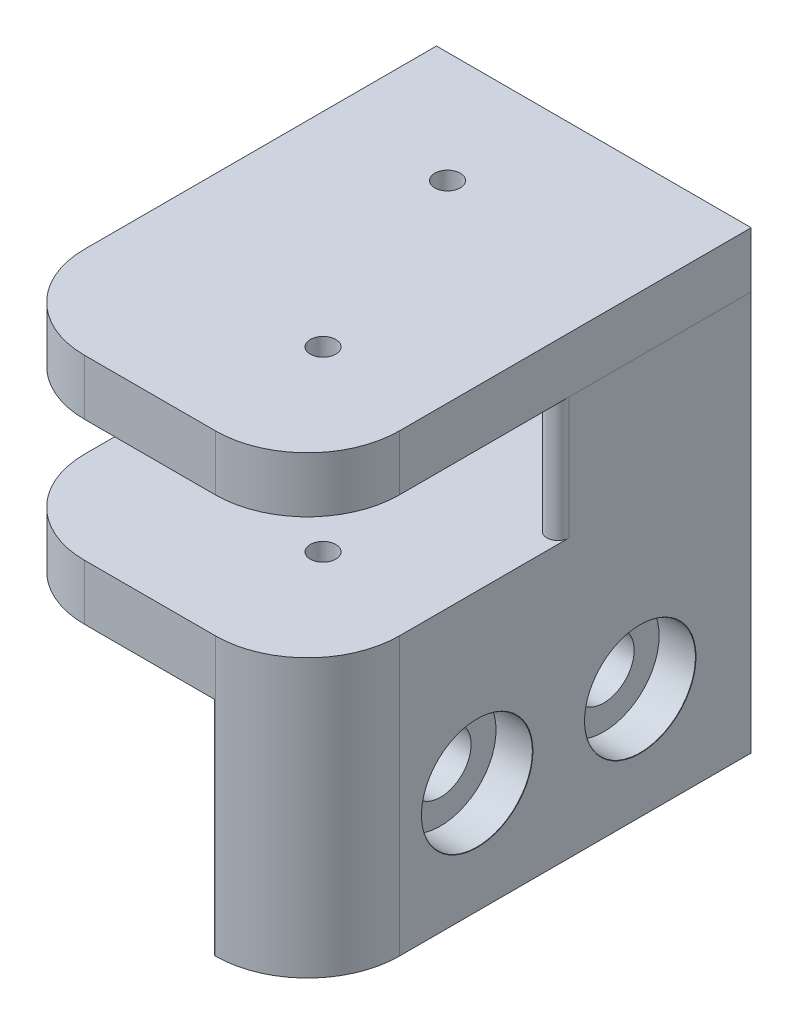
ISO-10303-21;
HEADER;
FILE_DESCRIPTION(('STEP AP214'),'2;1');
FILE_NAME('part.step','',(''),(''),'','','');
FILE_SCHEMA(('AUTOMOTIVE_DESIGN { 1 0 10303 214 1 1 1 1 }'));
ENDSEC;
DATA;
#1=APPLICATION_CONTEXT('core data for automotive mechanical design processes');
#2=APPLICATION_PROTOCOL_DEFINITION('international standard','automotive_design',2000,#1);
#3=PRODUCT_CONTEXT('',#1,'mechanical');
#4=PRODUCT('Part','Part','',(#3));
#5=PRODUCT_RELATED_PRODUCT_CATEGORY('part','',(#4));
#6=PRODUCT_DEFINITION_FORMATION('','',#4);
#7=PRODUCT_DEFINITION_CONTEXT('part definition',#1,'design');
#8=PRODUCT_DEFINITION('design','',#6,#7);
#9=PRODUCT_DEFINITION_SHAPE('','',#8);
#10=(LENGTH_UNIT() NAMED_UNIT(*) SI_UNIT(.MILLI.,.METRE.));
#11=(NAMED_UNIT(*) PLANE_ANGLE_UNIT() SI_UNIT($,.RADIAN.));
#12=(NAMED_UNIT(*) SI_UNIT($,.STERADIAN.) SOLID_ANGLE_UNIT());
#13=UNCERTAINTY_MEASURE_WITH_UNIT(LENGTH_MEASURE(1.E-05),#10,'distance_accuracy_value','');
#14=(GEOMETRIC_REPRESENTATION_CONTEXT(3) GLOBAL_UNCERTAINTY_ASSIGNED_CONTEXT((#13)) GLOBAL_UNIT_ASSIGNED_CONTEXT((#10,
#11,#12)) REPRESENTATION_CONTEXT('',''));
#15=CARTESIAN_POINT('',(0.,0.,0.));
#16=DIRECTION('',(0.,0.,1.));
#17=DIRECTION('',(1.,0.,0.));
#18=AXIS2_PLACEMENT_3D('',#15,#16,#17);
#19=CARTESIAN_POINT('',(0.,16.,0.));
#20=DIRECTION('',(0.,-1.,0.));
#21=DIRECTION('',(0.,0.,-1.));
#22=AXIS2_PLACEMENT_3D('',#19,#20,#21);
#23=PLANE('',#22);
#24=DIRECTION('',(-1.,0.,0.));
#25=VECTOR('',#24,1.);
#26=CARTESIAN_POINT('',(14.185,16.,-20.));
#27=LINE('',#26,#25);
#28=CARTESIAN_POINT('',(14.185,16.,-20.));
#29=VERTEX_POINT('',#28);
#30=CARTESIAN_POINT('',(-14.185,16.,-20.));
#31=VERTEX_POINT('',#30);
#32=EDGE_CURVE('E70',#29,#31,#27,.T.);
#33=ORIENTED_EDGE('',*,*,#32,.F.);
#34=DIRECTION('',(0.,0.,-1.));
#35=VECTOR('',#34,1.);
#36=CARTESIAN_POINT('',(14.185,16.,20.));
#37=LINE('',#36,#35);
#38=CARTESIAN_POINT('',(14.185,16.,11.7));
#39=VERTEX_POINT('',#38);
#40=EDGE_CURVE('E118',#39,#29,#37,.T.);
#41=ORIENTED_EDGE('',*,*,#40,.F.);
#42=CARTESIAN_POINT('',(5.885,16.,11.7));
#43=DIRECTION('',(0.,1.,0.));
#44=DIRECTION('',(0.,0.,1.));
#45=AXIS2_PLACEMENT_3D('',#42,#43,#44);
#46=CIRCLE('',#45,8.3);
#47=CARTESIAN_POINT('',(5.885,16.,20.));
#48=VERTEX_POINT('',#47);
#49=EDGE_CURVE('E96',#39,#48,#46,.F.);
#50=ORIENTED_EDGE('',*,*,#49,.T.);
#51=DIRECTION('',(1.,0.,0.));
#52=VECTOR('',#51,1.);
#53=CARTESIAN_POINT('',(-14.185,16.,20.));
#54=LINE('',#53,#52);
#55=CARTESIAN_POINT('',(-5.885,16.,20.));
#56=VERTEX_POINT('',#55);
#57=EDGE_CURVE('E145',#56,#48,#54,.T.);
#58=ORIENTED_EDGE('',*,*,#57,.F.);
#59=CARTESIAN_POINT('',(-5.885,16.,11.7));
#60=DIRECTION('',(0.,1.,0.));
#61=DIRECTION('',(0.,0.,1.));
#62=AXIS2_PLACEMENT_3D('',#59,#60,#61);
#63=CIRCLE('',#62,8.3);
#64=CARTESIAN_POINT('',(-14.185,16.,11.7));
#65=VERTEX_POINT('',#64);
#66=EDGE_CURVE('E88',#56,#65,#63,.F.);
#67=ORIENTED_EDGE('',*,*,#66,.T.);
#68=DIRECTION('',(0.,0.,1.));
#69=VECTOR('',#68,1.);
#70=CARTESIAN_POINT('',(-14.185,16.,-20.));
#71=LINE('',#70,#69);
#72=EDGE_CURVE('E120',#31,#65,#71,.T.);
#73=ORIENTED_EDGE('',*,*,#72,.F.);
#74=EDGE_LOOP('',(#33,#41,#50,#58,#67,#73));
#75=FACE_BOUND('',#74,.T.);
#76=CARTESIAN_POINT('',(-3.185,16.,-10.));
#77=DIRECTION('',(0.,-1.,0.));
#78=DIRECTION('',(0.,0.,-1.));
#79=AXIS2_PLACEMENT_3D('',#76,#77,#78);
#80=CIRCLE('',#79,1.15);
#81=CARTESIAN_POINT('',(-3.185,16.,-11.15));
#82=VERTEX_POINT('',#81);
#83=EDGE_CURVE('E62',#82,#82,#80,.T.);
#84=ORIENTED_EDGE('',*,*,#83,.F.);
#85=EDGE_LOOP('',(#84));
#86=FACE_BOUND('',#85,.T.);
#87=CARTESIAN_POINT('',(4.185,16.,8.59255496159686));
#88=DIRECTION('',(0.,1.,0.));
#89=DIRECTION('',(0.,0.,1.));
#90=AXIS2_PLACEMENT_3D('',#87,#88,#89);
#91=CIRCLE('',#90,1.15);
#92=CARTESIAN_POINT('',(4.185,16.,7.44255496159686));
#93=VERTEX_POINT('',#92);
#94=EDGE_CURVE('E129',#93,#93,#91,.T.);
#95=ORIENTED_EDGE('',*,*,#94,.T.);
#96=EDGE_LOOP('',(#95));
#97=FACE_BOUND('',#96,.T.);
#98=ADVANCED_FACE('F52',(#75,#86,#97),#23,.T.);
#99=CARTESIAN_POINT('',(-14.185,5.,-20.));
#100=DIRECTION('',(0.,0.,1.));
#101=DIRECTION('',(1.,0.,0.));
#102=AXIS2_PLACEMENT_3D('',#99,#100,#101);
#103=PLANE('',#102);
#104=DIRECTION('',(0.,-1.,0.));
#105=VECTOR('',#104,1.);
#106=CARTESIAN_POINT('',(14.185,5.,-20.));
#107=LINE('',#106,#105);
#108=CARTESIAN_POINT('',(14.185,21.,-20.));
#109=VERTEX_POINT('',#108);
#110=EDGE_CURVE('E56',#109,#29,#107,.T.);
#111=ORIENTED_EDGE('',*,*,#110,.T.);
#112=ORIENTED_EDGE('',*,*,#32,.T.);
#113=DIRECTION('',(0.,-1.,0.));
#114=VECTOR('',#113,1.);
#115=CARTESIAN_POINT('',(-14.185,21.,-20.));
#116=LINE('',#115,#114);
#117=CARTESIAN_POINT('',(-14.185,21.,-20.));
#118=VERTEX_POINT('',#117);
#119=EDGE_CURVE('E132',#118,#31,#116,.T.);
#120=ORIENTED_EDGE('',*,*,#119,.F.);
#121=DIRECTION('',(-1.,0.,0.));
#122=VECTOR('',#121,1.);
#123=CARTESIAN_POINT('',(14.185,21.,-20.));
#124=LINE('',#123,#122);
#125=EDGE_CURVE('E81',#109,#118,#124,.T.);
#126=ORIENTED_EDGE('',*,*,#125,.F.);
#127=EDGE_LOOP('',(#111,#112,#120,#126));
#128=FACE_BOUND('',#127,.T.);
#129=ADVANCED_FACE('F131',(#128),#103,.F.);
#130=CARTESIAN_POINT('',(-14.185,21.,-20.));
#131=DIRECTION('',(1.,0.,0.));
#132=DIRECTION('',(0.,0.,-1.));
#133=AXIS2_PLACEMENT_3D('',#130,#131,#132);
#134=PLANE('',#133);
#135=ORIENTED_EDGE('',*,*,#72,.T.);
#136=DIRECTION('',(0.,-1.,0.));
#137=VECTOR('',#136,1.);
#138=CARTESIAN_POINT('',(-14.185,21.,11.7));
#139=LINE('',#138,#137);
#140=CARTESIAN_POINT('',(-14.185,21.,11.7));
#141=VERTEX_POINT('',#140);
#142=EDGE_CURVE('E202',#65,#141,#139,.F.);
#143=ORIENTED_EDGE('',*,*,#142,.T.);
#144=DIRECTION('',(0.,0.,1.));
#145=VECTOR('',#144,1.);
#146=CARTESIAN_POINT('',(-14.185,21.,-20.));
#147=LINE('',#146,#145);
#148=EDGE_CURVE('E150',#118,#141,#147,.T.);
#149=ORIENTED_EDGE('',*,*,#148,.F.);
#150=ORIENTED_EDGE('',*,*,#119,.T.);
#151=EDGE_LOOP('',(#135,#143,#149,#150));
#152=FACE_BOUND('',#151,.T.);
#153=ADVANCED_FACE('F177',(#152),#134,.F.);
#154=CARTESIAN_POINT('',(14.185,5.,20.));
#155=DIRECTION('',(-1.,0.,0.));
#156=DIRECTION('',(0.,0.,1.));
#157=AXIS2_PLACEMENT_3D('',#154,#155,#156);
#158=PLANE('',#157);
#159=ORIENTED_EDGE('',*,*,#40,.T.);
#160=ORIENTED_EDGE('',*,*,#110,.F.);
#161=DIRECTION('',(0.,0.,-1.));
#162=VECTOR('',#161,1.);
#163=CARTESIAN_POINT('',(14.185,21.,20.));
#164=LINE('',#163,#162);
#165=CARTESIAN_POINT('',(14.185,21.,11.7));
#166=VERTEX_POINT('',#165);
#167=EDGE_CURVE('E147',#166,#109,#164,.T.);
#168=ORIENTED_EDGE('',*,*,#167,.F.);
#169=DIRECTION('',(0.,-1.,0.));
#170=VECTOR('',#169,1.);
#171=CARTESIAN_POINT('',(14.185,5.,11.7));
#172=LINE('',#171,#170);
#173=EDGE_CURVE('E128',#166,#39,#172,.T.);
#174=ORIENTED_EDGE('',*,*,#173,.T.);
#175=EDGE_LOOP('',(#159,#160,#168,#174));
#176=FACE_BOUND('',#175,.T.);
#177=ADVANCED_FACE('F125',(#176),#158,.F.);
#178=CARTESIAN_POINT('',(-14.185,21.,20.));
#179=DIRECTION('',(0.,0.,-1.));
#180=DIRECTION('',(-1.,0.,0.));
#181=AXIS2_PLACEMENT_3D('',#178,#179,#180);
#182=PLANE('',#181);
#183=DIRECTION('',(1.,0.,0.));
#184=VECTOR('',#183,1.);
#185=CARTESIAN_POINT('',(-14.185,21.,20.));
#186=LINE('',#185,#184);
#187=CARTESIAN_POINT('',(-5.885,21.,20.));
#188=VERTEX_POINT('',#187);
#189=CARTESIAN_POINT('',(5.885,21.,20.));
#190=VERTEX_POINT('',#189);
#191=EDGE_CURVE('E134',#188,#190,#186,.T.);
#192=ORIENTED_EDGE('',*,*,#191,.F.);
#193=DIRECTION('',(0.,-1.,0.));
#194=VECTOR('',#193,1.);
#195=CARTESIAN_POINT('',(-5.885,21.,20.));
#196=LINE('',#195,#194);
#197=EDGE_CURVE('E136',#188,#56,#196,.T.);
#198=ORIENTED_EDGE('',*,*,#197,.T.);
#199=ORIENTED_EDGE('',*,*,#57,.T.);
#200=DIRECTION('',(0.,-1.,0.));
#201=VECTOR('',#200,1.);
#202=CARTESIAN_POINT('',(5.885,21.,20.));
#203=LINE('',#202,#201);
#204=EDGE_CURVE('E133',#48,#190,#203,.F.);
#205=ORIENTED_EDGE('',*,*,#204,.T.);
#206=EDGE_LOOP('',(#192,#198,#199,#205));
#207=FACE_BOUND('',#206,.T.);
#208=ADVANCED_FACE('F185',(#207),#182,.F.);
#209=CARTESIAN_POINT('',(0.,21.,0.));
#210=DIRECTION('',(0.,1.,0.));
#211=DIRECTION('',(0.,0.,1.));
#212=AXIS2_PLACEMENT_3D('',#209,#210,#211);
#213=PLANE('',#212);
#214=CARTESIAN_POINT('',(-3.185,21.,-10.));
#215=DIRECTION('',(0.,1.,0.));
#216=DIRECTION('',(0.,0.,1.));
#217=AXIS2_PLACEMENT_3D('',#214,#215,#216);
#218=CIRCLE('',#217,1.15);
#219=CARTESIAN_POINT('',(-3.185,21.,-8.85));
#220=VERTEX_POINT('',#219);
#221=EDGE_CURVE('E13',#220,#220,#218,.F.);
#222=ORIENTED_EDGE('',*,*,#221,.T.);
#223=EDGE_LOOP('',(#222));
#224=FACE_BOUND('',#223,.T.);
#225=CARTESIAN_POINT('',(4.185,21.,8.59255496159686));
#226=DIRECTION('',(0.,-1.,0.));
#227=DIRECTION('',(0.,0.,-1.));
#228=AXIS2_PLACEMENT_3D('',#225,#226,#227);
#229=CIRCLE('',#228,1.15);
#230=CARTESIAN_POINT('',(4.185,21.,7.44255496159686));
#231=VERTEX_POINT('',#230);
#232=EDGE_CURVE('E156',#231,#231,#229,.T.);
#233=ORIENTED_EDGE('',*,*,#232,.T.);
#234=EDGE_LOOP('',(#233));
#235=FACE_BOUND('',#234,.T.);
#236=ORIENTED_EDGE('',*,*,#148,.T.);
#237=CARTESIAN_POINT('',(-5.885,21.,11.7));
#238=DIRECTION('',(0.,1.,0.));
#239=DIRECTION('',(0.,0.,1.));
#240=AXIS2_PLACEMENT_3D('',#237,#238,#239);
#241=CIRCLE('',#240,8.3);
#242=EDGE_CURVE('E203',#141,#188,#241,.T.);
#243=ORIENTED_EDGE('',*,*,#242,.T.);
#244=ORIENTED_EDGE('',*,*,#191,.T.);
#245=CARTESIAN_POINT('',(5.885,21.,11.7));
#246=DIRECTION('',(0.,1.,0.));
#247=DIRECTION('',(0.,0.,1.));
#248=AXIS2_PLACEMENT_3D('',#245,#246,#247);
#249=CIRCLE('',#248,8.3);
#250=EDGE_CURVE('E201',#190,#166,#249,.T.);
#251=ORIENTED_EDGE('',*,*,#250,.T.);
#252=ORIENTED_EDGE('',*,*,#167,.T.);
#253=ORIENTED_EDGE('',*,*,#125,.T.);
#254=EDGE_LOOP('',(#236,#243,#244,#251,#252,#253));
#255=FACE_BOUND('',#254,.T.);
#256=ADVANCED_FACE('F187',(#224,#235,#255),#213,.T.);
#257=CARTESIAN_POINT('',(5.885,5.,11.7));
#258=DIRECTION('',(0.,-1.,0.));
#259=DIRECTION('',(0.,0.,-1.));
#260=AXIS2_PLACEMENT_3D('',#257,#258,#259);
#261=CYLINDRICAL_SURFACE('',#260,8.3);
#262=ORIENTED_EDGE('',*,*,#250,.F.);
#263=ORIENTED_EDGE('',*,*,#204,.F.);
#264=ORIENTED_EDGE('',*,*,#49,.F.);
#265=ORIENTED_EDGE('',*,*,#173,.F.);
#266=EDGE_LOOP('',(#262,#263,#264,#265));
#267=FACE_BOUND('',#266,.T.);
#268=ADVANCED_FACE('F190',(#267),#261,.T.);
#269=CARTESIAN_POINT('',(-5.885,21.,11.7));
#270=DIRECTION('',(0.,-1.,0.));
#271=DIRECTION('',(0.,0.,-1.));
#272=AXIS2_PLACEMENT_3D('',#269,#270,#271);
#273=CYLINDRICAL_SURFACE('',#272,8.3);
#274=ORIENTED_EDGE('',*,*,#242,.F.);
#275=ORIENTED_EDGE('',*,*,#142,.F.);
#276=ORIENTED_EDGE('',*,*,#66,.F.);
#277=ORIENTED_EDGE('',*,*,#197,.F.);
#278=EDGE_LOOP('',(#274,#275,#276,#277));
#279=FACE_BOUND('',#278,.T.);
#280=ADVANCED_FACE('F172',(#279),#273,.T.);
#281=CARTESIAN_POINT('',(-3.185,21.001,-10.));
#282=DIRECTION('',(0.,-1.,0.));
#283=DIRECTION('',(0.,0.,-1.));
#284=AXIS2_PLACEMENT_3D('',#281,#282,#283);
#285=CYLINDRICAL_SURFACE('',#284,1.15);
#286=ORIENTED_EDGE('',*,*,#221,.F.);
#287=EDGE_LOOP('',(#286));
#288=FACE_BOUND('',#287,.T.);
#289=ORIENTED_EDGE('',*,*,#83,.T.);
#290=EDGE_LOOP('',(#289));
#291=FACE_BOUND('',#290,.T.);
#292=ADVANCED_FACE('F161',(#288,#291),#285,.F.);
#293=CARTESIAN_POINT('',(4.185,21.,8.59255496159686));
#294=DIRECTION('',(0.,-1.,0.));
#295=DIRECTION('',(0.,0.,-1.));
#296=AXIS2_PLACEMENT_3D('',#293,#294,#295);
#297=CYLINDRICAL_SURFACE('',#296,1.15);
#298=CARTESIAN_POINT('',(4.185,21.,7.44255496159686));
#299=CARTESIAN_POINT('',(4.185,20.9479166666667,7.44255496159686));
#300=CARTESIAN_POINT('',(4.185,20.8958333333333,7.44255496159686));
#301=CARTESIAN_POINT('',(4.185,20.7916666666667,7.44255496159686));
#302=CARTESIAN_POINT('',(4.185,20.7395833333333,7.44255496159686));
#303=CARTESIAN_POINT('',(4.185,20.6354166666667,7.44255496159686));
#304=CARTESIAN_POINT('',(4.185,20.5833333333333,7.44255496159686));
#305=CARTESIAN_POINT('',(4.185,20.4791666666667,7.44255496159686));
#306=CARTESIAN_POINT('',(4.185,20.4270833333333,7.44255496159686));
#307=CARTESIAN_POINT('',(4.185,20.3229166666667,7.44255496159686));
#308=CARTESIAN_POINT('',(4.185,20.2708333333333,7.44255496159686));
#309=CARTESIAN_POINT('',(4.185,20.1666666666667,7.44255496159686));
#310=CARTESIAN_POINT('',(4.185,20.1145833333333,7.44255496159686));
#311=CARTESIAN_POINT('',(4.185,20.0104166666667,7.44255496159686));
#312=CARTESIAN_POINT('',(4.185,19.9583333333333,7.44255496159686));
#313=CARTESIAN_POINT('',(4.185,19.8541666666667,7.44255496159686));
#314=CARTESIAN_POINT('',(4.185,19.8020833333333,7.44255496159686));
#315=CARTESIAN_POINT('',(4.185,19.6979166666667,7.44255496159686));
#316=CARTESIAN_POINT('',(4.185,19.6458333333333,7.44255496159686));
#317=CARTESIAN_POINT('',(4.185,19.5416666666667,7.44255496159686));
#318=CARTESIAN_POINT('',(4.185,19.4895833333333,7.44255496159686));
#319=CARTESIAN_POINT('',(4.185,19.3854166666667,7.44255496159686));
#320=CARTESIAN_POINT('',(4.185,19.3333333333333,7.44255496159686));
#321=CARTESIAN_POINT('',(4.185,19.2291666666667,7.44255496159686));
#322=CARTESIAN_POINT('',(4.185,19.1770833333333,7.44255496159686));
#323=CARTESIAN_POINT('',(4.185,19.0729166666667,7.44255496159686));
#324=CARTESIAN_POINT('',(4.185,19.0208333333333,7.44255496159686));
#325=CARTESIAN_POINT('',(4.185,18.9166666666667,7.44255496159686));
#326=CARTESIAN_POINT('',(4.185,18.8645833333333,7.44255496159686));
#327=CARTESIAN_POINT('',(4.185,18.7604166666667,7.44255496159686));
#328=CARTESIAN_POINT('',(4.185,18.7083333333333,7.44255496159686));
#329=CARTESIAN_POINT('',(4.185,18.6041666666667,7.44255496159686));
#330=CARTESIAN_POINT('',(4.185,18.5520833333333,7.44255496159686));
#331=CARTESIAN_POINT('',(4.185,18.4479166666667,7.44255496159686));
#332=CARTESIAN_POINT('',(4.185,18.3958333333333,7.44255496159686));
#333=CARTESIAN_POINT('',(4.185,18.2916666666667,7.44255496159686));
#334=CARTESIAN_POINT('',(4.185,18.2395833333333,7.44255496159686));
#335=CARTESIAN_POINT('',(4.185,18.1354166666667,7.44255496159686));
#336=CARTESIAN_POINT('',(4.185,18.0833333333333,7.44255496159686));
#337=CARTESIAN_POINT('',(4.185,17.9791666666667,7.44255496159686));
#338=CARTESIAN_POINT('',(4.185,17.9270833333333,7.44255496159686));
#339=CARTESIAN_POINT('',(4.185,17.8229166666667,7.44255496159686));
#340=CARTESIAN_POINT('',(4.185,17.7708333333333,7.44255496159686));
#341=CARTESIAN_POINT('',(4.185,17.6666666666667,7.44255496159686));
#342=CARTESIAN_POINT('',(4.185,17.6145833333333,7.44255496159686));
#343=CARTESIAN_POINT('',(4.185,17.5104166666667,7.44255496159686));
#344=CARTESIAN_POINT('',(4.185,17.4583333333333,7.44255496159686));
#345=CARTESIAN_POINT('',(4.185,17.3541666666667,7.44255496159686));
#346=CARTESIAN_POINT('',(4.185,17.3020833333333,7.44255496159686));
#347=CARTESIAN_POINT('',(4.185,17.1979166666667,7.44255496159686));
#348=CARTESIAN_POINT('',(4.185,17.1458333333333,7.44255496159686));
#349=CARTESIAN_POINT('',(4.185,17.0416666666667,7.44255496159686));
#350=CARTESIAN_POINT('',(4.185,16.9895833333333,7.44255496159686));
#351=CARTESIAN_POINT('',(4.185,16.8854166666667,7.44255496159686));
#352=CARTESIAN_POINT('',(4.185,16.8333333333333,7.44255496159686));
#353=CARTESIAN_POINT('',(4.185,16.7291666666667,7.44255496159686));
#354=CARTESIAN_POINT('',(4.185,16.6770833333333,7.44255496159686));
#355=CARTESIAN_POINT('',(4.185,16.5729166666667,7.44255496159686));
#356=CARTESIAN_POINT('',(4.185,16.5208333333333,7.44255496159686));
#357=CARTESIAN_POINT('',(4.185,16.4166666666667,7.44255496159686));
#358=CARTESIAN_POINT('',(4.185,16.3645833333333,7.44255496159686));
#359=CARTESIAN_POINT('',(4.185,16.2604166666667,7.44255496159686));
#360=CARTESIAN_POINT('',(4.185,16.2083333333333,7.44255496159686));
#361=CARTESIAN_POINT('',(4.185,16.1041666666667,7.44255496159686));
#362=CARTESIAN_POINT('',(4.185,16.0520833333333,7.44255496159686));
#363=CARTESIAN_POINT('',(4.185,16.,7.44255496159686));
#364=B_SPLINE_CURVE_WITH_KNOTS('',3,(#298,#299,#300,#301,#302,#303,#304,#305,#306,#307,#308,
#309,#310,#311,#312,#313,#314,#315,#316,#317,#318,#319,#320,#321,#322,#323,#324,#325,#326,#327,
#328,#329,#330,#331,#332,#333,#334,#335,#336,#337,#338,#339,#340,#341,#342,#343,#344,#345,#346,
#347,#348,#349,#350,#351,#352,#353,#354,#355,#356,#357,#358,#359,#360,#361,#362,#363),
.UNSPECIFIED.,.F.,.F.,(4,2,2,2,2,2,2,2,2,2,2,2,2,2,2,2,2,2,2,2,2,2,2,2,2,2,2,2,2,2,2,2,4),(0.,
0.15625,0.3125,0.46875,0.625000000000001,0.781250000000001,0.937500000000001,1.09375,1.25,
1.40625,1.5625,1.71875,1.875,2.03125,2.1875,2.34375,2.5,2.65625,2.8125,2.96875,3.125,3.28125,
3.4375,3.59375,3.75,3.90625,4.0625,4.21875,4.375,4.53125,4.6875,4.84375,5.),.UNSPECIFIED.);
#365=EDGE_CURVE('BSEAM54',#231,#93,#364,.T.);
#366=ORIENTED_EDGE('',*,*,#232,.F.);
#367=ORIENTED_EDGE('',*,*,#94,.F.);
#368=ORIENTED_EDGE('',*,*,#365,.T.);
#369=ORIENTED_EDGE('',*,*,#365,.F.);
#370=EDGE_LOOP('',(#366,#368,#367,#369));
#371=FACE_BOUND('',#370,.T.);
#372=ADVANCED_FACE('F54',(#371),#297,.F.);
#373=CLOSED_SHELL('',(#98,#129,#153,#177,#208,#256,#268,#280,#292,#372));
#374=MANIFOLD_SOLID_BREP('B2',#373);
#375=CARTESIAN_POINT('',(14.185,5.,20.));
#376=DIRECTION('',(-1.,0.,0.));
#377=DIRECTION('',(0.,0.,1.));
#378=AXIS2_PLACEMENT_3D('',#375,#376,#377);
#379=PLANE('',#378);
#380=CARTESIAN_POINT('',(14.185,-10.,-10.));
#381=DIRECTION('',(1.,0.,0.));
#382=DIRECTION('',(0.,0.,-1.));
#383=AXIS2_PLACEMENT_3D('',#380,#381,#382);
#384=CIRCLE('',#383,5.025);
#385=CARTESIAN_POINT('',(14.185,-10.,-15.025));
#386=VERTEX_POINT('',#385);
#387=EDGE_CURVE('E593',#386,#386,#384,.T.);
#388=ORIENTED_EDGE('',*,*,#387,.F.);
#389=EDGE_LOOP('',(#388));
#390=FACE_BOUND('',#389,.T.);
#391=DIRECTION('',(0.,-1.,0.));
#392=VECTOR('',#391,1.);
#393=CARTESIAN_POINT('',(14.185,5.,-20.));
#394=LINE('',#393,#392);
#395=CARTESIAN_POINT('',(14.185,16.,-20.));
#396=VERTEX_POINT('',#395);
#397=CARTESIAN_POINT('',(14.185,-20.,-20.));
#398=VERTEX_POINT('',#397);
#399=EDGE_CURVE('E445',#396,#398,#394,.T.);
#400=ORIENTED_EDGE('',*,*,#399,.F.);
#401=DIRECTION('',(0.,0.,1.));
#402=VECTOR('',#401,1.);
#403=CARTESIAN_POINT('',(14.185,16.,20.));
#404=LINE('',#403,#402);
#405=CARTESIAN_POINT('',(14.185,16.,-3.58458045626301));
#406=VERTEX_POINT('',#405);
#407=EDGE_CURVE('E295',#396,#406,#404,.T.);
#408=ORIENTED_EDGE('',*,*,#407,.T.);
#409=DIRECTION('',(0.,-1.,0.));
#410=VECTOR('',#409,1.);
#411=CARTESIAN_POINT('',(14.185,5.,-3.58458045626301));
#412=LINE('',#411,#410);
#413=CARTESIAN_POINT('',(14.185,5.,-3.58458045626301));
#414=VERTEX_POINT('',#413);
#415=EDGE_CURVE('E447',#406,#414,#412,.T.);
#416=ORIENTED_EDGE('',*,*,#415,.T.);
#417=DIRECTION('',(0.,0.,-1.));
#418=VECTOR('',#417,1.);
#419=CARTESIAN_POINT('',(14.185,5.,20.));
#420=LINE('',#419,#418);
#421=CARTESIAN_POINT('',(14.185,5.,11.7));
#422=VERTEX_POINT('',#421);
#423=EDGE_CURVE('E427',#422,#414,#420,.T.);
#424=ORIENTED_EDGE('',*,*,#423,.F.);
#425=DIRECTION('',(0.,-1.,0.));
#426=VECTOR('',#425,1.);
#427=CARTESIAN_POINT('',(14.185,5.,11.7));
#428=LINE('',#427,#426);
#429=CARTESIAN_POINT('',(14.185,-20.,11.7));
#430=VERTEX_POINT('',#429);
#431=EDGE_CURVE('E469',#422,#430,#428,.T.);
#432=ORIENTED_EDGE('',*,*,#431,.T.);
#433=DIRECTION('',(0.,0.,1.));
#434=VECTOR('',#433,1.);
#435=CARTESIAN_POINT('',(14.185,-20.,20.));
#436=LINE('',#435,#434);
#437=EDGE_CURVE('E407',#398,#430,#436,.T.);
#438=ORIENTED_EDGE('',*,*,#437,.F.);
#439=EDGE_LOOP('',(#400,#408,#416,#424,#432,#438));
#440=FACE_BOUND('',#439,.T.);
#441=CARTESIAN_POINT('',(14.185,-10.,4.7));
#442=DIRECTION('',(1.,0.,0.));
#443=DIRECTION('',(0.,0.,-1.));
#444=AXIS2_PLACEMENT_3D('',#441,#442,#443);
#445=CIRCLE('',#444,5.025);
#446=CARTESIAN_POINT('',(14.185,-10.,-0.325000000000006));
#447=VERTEX_POINT('',#446);
#448=EDGE_CURVE('E580',#447,#447,#445,.T.);
#449=ORIENTED_EDGE('',*,*,#448,.F.);
#450=EDGE_LOOP('',(#449));
#451=FACE_BOUND('',#450,.T.);
#452=ADVANCED_FACE('F291',(#390,#440,#451),#379,.F.);
#453=CARTESIAN_POINT('',(0.,16.,0.));
#454=DIRECTION('',(0.,-1.,0.));
#455=DIRECTION('',(0.,0.,-1.));
#456=AXIS2_PLACEMENT_3D('',#453,#454,#455);
#457=PLANE('',#456);
#458=CARTESIAN_POINT('',(13.185,16.,-3.58458045626301));
#459=DIRECTION('',(0.,1.,0.));
#460=DIRECTION('',(0.,0.,1.));
#461=AXIS2_PLACEMENT_3D('',#458,#459,#460);
#462=CIRCLE('',#461,1.);
#463=CARTESIAN_POINT('',(12.3294124958943,16.,-3.0669222458402));
#464=VERTEX_POINT('',#463);
#465=EDGE_CURVE('E454',#464,#406,#462,.T.);
#466=ORIENTED_EDGE('',*,*,#465,.T.);
#467=ORIENTED_EDGE('',*,*,#407,.F.);
#468=DIRECTION('',(1.,0.,0.));
#469=VECTOR('',#468,1.);
#470=CARTESIAN_POINT('',(-14.185,16.,-20.));
#471=LINE('',#470,#469);
#472=CARTESIAN_POINT('',(6.815,16.,-20.));
#473=VERTEX_POINT('',#472);
#474=EDGE_CURVE('E473',#473,#396,#471,.T.);
#475=ORIENTED_EDGE('',*,*,#474,.F.);
#476=DIRECTION('',(0.,0.,1.));
#477=VECTOR('',#476,1.);
#478=CARTESIAN_POINT('',(6.815,16.,-20.));
#479=LINE('',#478,#477);
#480=CARTESIAN_POINT('',(6.815,16.,-12.1811646725524));
#481=VERTEX_POINT('',#480);
#482=EDGE_CURVE('E50',#473,#481,#479,.T.);
#483=ORIENTED_EDGE('',*,*,#482,.T.);
#484=DIRECTION('',(0.517658210422817,0.,0.855587504105715));
#485=VECTOR('',#484,1.);
#486=CARTESIAN_POINT('',(6.815,16.,-12.1811646725524));
#487=LINE('',#486,#485);
#488=EDGE_CURVE('E300',#481,#464,#487,.T.);
#489=ORIENTED_EDGE('',*,*,#488,.T.);
#490=EDGE_LOOP('',(#466,#467,#475,#483,#489));
#491=FACE_BOUND('',#490,.T.);
#492=ADVANCED_FACE('F293',(#491),#457,.F.);
#493=CARTESIAN_POINT('',(0.,5.,0.));
#494=DIRECTION('',(0.,-1.,0.));
#495=DIRECTION('',(0.,0.,-1.));
#496=AXIS2_PLACEMENT_3D('',#493,#494,#495);
#497=PLANE('',#496);
#498=CARTESIAN_POINT('',(4.185,5.,8.59255496159686));
#499=DIRECTION('',(0.,-1.,0.));
#500=DIRECTION('',(0.,0.,-1.));
#501=AXIS2_PLACEMENT_3D('',#498,#499,#500);
#502=CIRCLE('',#501,1.15);
#503=CARTESIAN_POINT('',(4.185,5.,7.44255496159686));
#504=VERTEX_POINT('',#503);
#505=EDGE_CURVE('E394',#504,#504,#502,.T.);
#506=ORIENTED_EDGE('',*,*,#505,.T.);
#507=EDGE_LOOP('',(#506));
#508=FACE_BOUND('',#507,.T.);
#509=CARTESIAN_POINT('',(-3.185,5.,-10.));
#510=DIRECTION('',(0.,-1.,0.));
#511=DIRECTION('',(0.,0.,-1.));
#512=AXIS2_PLACEMENT_3D('',#509,#510,#511);
#513=CIRCLE('',#512,1.1485231685851);
#514=CARTESIAN_POINT('',(-3.185,5.,-11.1485231685851));
#515=VERTEX_POINT('',#514);
#516=EDGE_CURVE('E421',#515,#515,#513,.T.);
#517=ORIENTED_EDGE('',*,*,#516,.T.);
#518=EDGE_LOOP('',(#517));
#519=FACE_BOUND('',#518,.T.);
#520=DIRECTION('',(0.,0.,1.));
#521=VECTOR('',#520,1.);
#522=CARTESIAN_POINT('',(-14.185,5.,20.));
#523=LINE('',#522,#521);
#524=CARTESIAN_POINT('',(-14.185,5.,-20.));
#525=VERTEX_POINT('',#524);
#526=CARTESIAN_POINT('',(-14.185,5.,11.7));
#527=VERTEX_POINT('',#526);
#528=EDGE_CURVE('E432',#525,#527,#523,.T.);
#529=ORIENTED_EDGE('',*,*,#528,.T.);
#530=CARTESIAN_POINT('',(-5.885,5.,11.7));
#531=DIRECTION('',(0.,-1.,0.));
#532=DIRECTION('',(0.,0.,-1.));
#533=AXIS2_PLACEMENT_3D('',#530,#531,#532);
#534=CIRCLE('',#533,8.3);
#535=CARTESIAN_POINT('',(-5.885,5.,20.));
#536=VERTEX_POINT('',#535);
#537=EDGE_CURVE('E467',#527,#536,#534,.F.);
#538=ORIENTED_EDGE('',*,*,#537,.T.);
#539=DIRECTION('',(1.,0.,0.));
#540=VECTOR('',#539,1.);
#541=CARTESIAN_POINT('',(-14.185,5.,20.));
#542=LINE('',#541,#540);
#543=CARTESIAN_POINT('',(5.885,5.,20.));
#544=VERTEX_POINT('',#543);
#545=EDGE_CURVE('E434',#536,#544,#542,.T.);
#546=ORIENTED_EDGE('',*,*,#545,.T.);
#547=CARTESIAN_POINT('',(5.885,5.,11.7));
#548=DIRECTION('',(0.,-1.,0.));
#549=DIRECTION('',(0.,0.,-1.));
#550=AXIS2_PLACEMENT_3D('',#547,#548,#549);
#551=CIRCLE('',#550,8.3);
#552=EDGE_CURVE('E465',#544,#422,#551,.F.);
#553=ORIENTED_EDGE('',*,*,#552,.T.);
#554=ORIENTED_EDGE('',*,*,#423,.T.);
#555=CARTESIAN_POINT('',(13.185,5.,-3.58458045626301));
#556=DIRECTION('',(0.,-1.,0.));
#557=DIRECTION('',(0.,0.,-1.));
#558=AXIS2_PLACEMENT_3D('',#555,#556,#557);
#559=CIRCLE('',#558,1.);
#560=CARTESIAN_POINT('',(12.3294124958943,5.,-3.0669222458402));
#561=VERTEX_POINT('',#560);
#562=EDGE_CURVE('E387',#414,#561,#559,.T.);
#563=ORIENTED_EDGE('',*,*,#562,.T.);
#564=DIRECTION('',(0.517658210422817,0.,0.855587504105715));
#565=VECTOR('',#564,1.);
#566=CARTESIAN_POINT('',(6.815,5.,-12.1811646725524));
#567=LINE('',#566,#565);
#568=CARTESIAN_POINT('',(6.815,5.,-12.1811646725524));
#569=VERTEX_POINT('',#568);
#570=EDGE_CURVE('E380',#569,#561,#567,.T.);
#571=ORIENTED_EDGE('',*,*,#570,.F.);
#572=DIRECTION('',(0.,0.,1.));
#573=VECTOR('',#572,1.);
#574=CARTESIAN_POINT('',(6.815,5.,-20.));
#575=LINE('',#574,#573);
#576=CARTESIAN_POINT('',(6.815,5.,-20.));
#577=VERTEX_POINT('',#576);
#578=EDGE_CURVE('E384',#577,#569,#575,.T.);
#579=ORIENTED_EDGE('',*,*,#578,.F.);
#580=DIRECTION('',(-1.,0.,0.));
#581=VECTOR('',#580,1.);
#582=CARTESIAN_POINT('',(-14.185,5.,-20.));
#583=LINE('',#582,#581);
#584=EDGE_CURVE('E429',#577,#525,#583,.T.);
#585=ORIENTED_EDGE('',*,*,#584,.T.);
#586=EDGE_LOOP('',(#529,#538,#546,#553,#554,#563,#571,#579,#585));
#587=FACE_BOUND('',#586,.T.);
#588=ADVANCED_FACE('F383',(#508,#519,#587),#497,.F.);
#589=CARTESIAN_POINT('',(-14.185,5.,-20.));
#590=DIRECTION('',(0.,0.,1.));
#591=DIRECTION('',(1.,0.,0.));
#592=AXIS2_PLACEMENT_3D('',#589,#590,#591);
#593=PLANE('',#592);
#594=DIRECTION('',(0.,-1.,0.));
#595=VECTOR('',#594,1.);
#596=CARTESIAN_POINT('',(6.815,16.,-20.));
#597=LINE('',#596,#595);
#598=EDGE_CURVE('E393',#473,#577,#597,.T.);
#599=ORIENTED_EDGE('',*,*,#598,.F.);
#600=ORIENTED_EDGE('',*,*,#474,.T.);
#601=ORIENTED_EDGE('',*,*,#399,.T.);
#602=DIRECTION('',(1.,0.,0.));
#603=VECTOR('',#602,1.);
#604=CARTESIAN_POINT('',(5.81500000000001,-20.,-20.));
#605=LINE('',#604,#603);
#606=CARTESIAN_POINT('',(5.81500000000001,-20.,-20.));
#607=VERTEX_POINT('',#606);
#608=EDGE_CURVE('E404',#607,#398,#605,.T.);
#609=ORIENTED_EDGE('',*,*,#608,.F.);
#610=DIRECTION('',(0.,1.,0.));
#611=VECTOR('',#610,1.);
#612=CARTESIAN_POINT('',(5.81500000000001,-20.,-20.));
#613=LINE('',#612,#611);
#614=CARTESIAN_POINT('',(5.81500000000001,0.,-20.));
#615=VERTEX_POINT('',#614);
#616=EDGE_CURVE('E417',#607,#615,#613,.T.);
#617=ORIENTED_EDGE('',*,*,#616,.T.);
#618=DIRECTION('',(-1.,0.,0.));
#619=VECTOR('',#618,1.);
#620=CARTESIAN_POINT('',(-14.185,0.,-20.));
#621=LINE('',#620,#619);
#622=CARTESIAN_POINT('',(-14.185,0.,-20.));
#623=VERTEX_POINT('',#622);
#624=EDGE_CURVE('E424',#615,#623,#621,.T.);
#625=ORIENTED_EDGE('',*,*,#624,.T.);
#626=DIRECTION('',(0.,-1.,0.));
#627=VECTOR('',#626,1.);
#628=CARTESIAN_POINT('',(-14.185,5.,-20.));
#629=LINE('',#628,#627);
#630=EDGE_CURVE('E437',#525,#623,#629,.T.);
#631=ORIENTED_EDGE('',*,*,#630,.F.);
#632=ORIENTED_EDGE('',*,*,#584,.F.);
#633=EDGE_LOOP('',(#599,#600,#601,#609,#617,#625,#631,#632));
#634=FACE_BOUND('',#633,.T.);
#635=ADVANCED_FACE('F509',(#634),#593,.F.);
#636=CARTESIAN_POINT('',(-14.185,5.,20.));
#637=DIRECTION('',(1.,0.,0.));
#638=DIRECTION('',(0.,0.,-1.));
#639=AXIS2_PLACEMENT_3D('',#636,#637,#638);
#640=PLANE('',#639);
#641=DIRECTION('',(0.,0.,1.));
#642=VECTOR('',#641,1.);
#643=CARTESIAN_POINT('',(-14.185,0.,20.));
#644=LINE('',#643,#642);
#645=CARTESIAN_POINT('',(-14.185,0.,11.7));
#646=VERTEX_POINT('',#645);
#647=EDGE_CURVE('E439',#623,#646,#644,.T.);
#648=ORIENTED_EDGE('',*,*,#647,.T.);
#649=DIRECTION('',(0.,-1.,0.));
#650=VECTOR('',#649,1.);
#651=CARTESIAN_POINT('',(-14.185,5.,11.7));
#652=LINE('',#651,#650);
#653=EDGE_CURVE('E463',#646,#527,#652,.F.);
#654=ORIENTED_EDGE('',*,*,#653,.T.);
#655=ORIENTED_EDGE('',*,*,#528,.F.);
#656=ORIENTED_EDGE('',*,*,#630,.T.);
#657=EDGE_LOOP('',(#648,#654,#655,#656));
#658=FACE_BOUND('',#657,.T.);
#659=ADVANCED_FACE('F512',(#658),#640,.F.);
#660=CARTESIAN_POINT('',(-14.185,5.,20.));
#661=DIRECTION('',(0.,0.,-1.));
#662=DIRECTION('',(-1.,0.,0.));
#663=AXIS2_PLACEMENT_3D('',#660,#661,#662);
#664=PLANE('',#663);
#665=ORIENTED_EDGE('',*,*,#545,.F.);
#666=DIRECTION('',(0.,-1.,0.));
#667=VECTOR('',#666,1.);
#668=CARTESIAN_POINT('',(-5.885,5.,20.));
#669=LINE('',#668,#667);
#670=CARTESIAN_POINT('',(-5.885,0.,20.));
#671=VERTEX_POINT('',#670);
#672=EDGE_CURVE('E458',#536,#671,#669,.T.);
#673=ORIENTED_EDGE('',*,*,#672,.T.);
#674=DIRECTION('',(1.,0.,0.));
#675=VECTOR('',#674,1.);
#676=CARTESIAN_POINT('',(-14.185,0.,20.));
#677=LINE('',#676,#675);
#678=CARTESIAN_POINT('',(5.815,0.,20.));
#679=VERTEX_POINT('',#678);
#680=EDGE_CURVE('E430',#671,#679,#677,.T.);
#681=ORIENTED_EDGE('',*,*,#680,.T.);
#682=DIRECTION('',(0.,1.,0.));
#683=VECTOR('',#682,1.);
#684=CARTESIAN_POINT('',(5.815,-20.,20.));
#685=LINE('',#684,#683);
#686=CARTESIAN_POINT('',(5.815,-20.,20.));
#687=VERTEX_POINT('',#686);
#688=EDGE_CURVE('E412',#687,#679,#685,.T.);
#689=ORIENTED_EDGE('',*,*,#688,.F.);
#690=DIRECTION('',(-1.,0.,0.));
#691=VECTOR('',#690,1.);
#692=CARTESIAN_POINT('',(5.815,-20.,20.));
#693=LINE('',#692,#691);
#694=CARTESIAN_POINT('',(5.885,-20.,20.));
#695=VERTEX_POINT('',#694);
#696=EDGE_CURVE('E410',#695,#687,#693,.T.);
#697=ORIENTED_EDGE('',*,*,#696,.F.);
#698=DIRECTION('',(0.,-1.,0.));
#699=VECTOR('',#698,1.);
#700=CARTESIAN_POINT('',(5.885,5.,20.));
#701=LINE('',#700,#699);
#702=EDGE_CURVE('E453',#695,#544,#701,.F.);
#703=ORIENTED_EDGE('',*,*,#702,.T.);
#704=EDGE_LOOP('',(#665,#673,#681,#689,#697,#703));
#705=FACE_BOUND('',#704,.T.);
#706=ADVANCED_FACE('F515',(#705),#664,.F.);
#707=CARTESIAN_POINT('',(0.,0.,0.));
#708=DIRECTION('',(0.,-1.,0.));
#709=DIRECTION('',(0.,0.,-1.));
#710=AXIS2_PLACEMENT_3D('',#707,#708,#709);
#711=PLANE('',#710);
#712=CARTESIAN_POINT('',(4.185,0.,8.59255496159686));
#713=DIRECTION('',(0.,-1.,0.));
#714=DIRECTION('',(0.,0.,-1.));
#715=AXIS2_PLACEMENT_3D('',#712,#713,#714);
#716=CIRCLE('',#715,1.15);
#717=CARTESIAN_POINT('',(4.185,0.,7.44255496159686));
#718=VERTEX_POINT('',#717);
#719=EDGE_CURVE('E608',#718,#718,#716,.T.);
#720=ORIENTED_EDGE('',*,*,#719,.F.);
#721=EDGE_LOOP('',(#720));
#722=FACE_BOUND('',#721,.T.);
#723=ORIENTED_EDGE('',*,*,#680,.F.);
#724=CARTESIAN_POINT('',(-5.885,0.,11.7));
#725=DIRECTION('',(0.,-1.,0.));
#726=DIRECTION('',(0.,0.,-1.));
#727=AXIS2_PLACEMENT_3D('',#724,#725,#726);
#728=CIRCLE('',#727,8.3);
#729=EDGE_CURVE('E461',#671,#646,#728,.T.);
#730=ORIENTED_EDGE('',*,*,#729,.T.);
#731=ORIENTED_EDGE('',*,*,#647,.F.);
#732=ORIENTED_EDGE('',*,*,#624,.F.);
#733=DIRECTION('',(0.,0.,-1.));
#734=VECTOR('',#733,1.);
#735=CARTESIAN_POINT('',(5.815,0.,20.));
#736=LINE('',#735,#734);
#737=EDGE_CURVE('E398',#679,#615,#736,.T.);
#738=ORIENTED_EDGE('',*,*,#737,.F.);
#739=EDGE_LOOP('',(#723,#730,#731,#732,#738));
#740=FACE_BOUND('',#739,.T.);
#741=CARTESIAN_POINT('',(-3.185,0.,-10.));
#742=DIRECTION('',(0.,-1.,0.));
#743=DIRECTION('',(0.,0.,-1.));
#744=AXIS2_PLACEMENT_3D('',#741,#742,#743);
#745=CIRCLE('',#744,1.1485231685851);
#746=CARTESIAN_POINT('',(-3.185,0.,-11.1485231685851));
#747=VERTEX_POINT('',#746);
#748=EDGE_CURVE('E420',#747,#747,#745,.T.);
#749=ORIENTED_EDGE('',*,*,#748,.F.);
#750=EDGE_LOOP('',(#749));
#751=FACE_BOUND('',#750,.T.);
#752=ADVANCED_FACE('F519',(#722,#740,#751),#711,.T.);
#753=CARTESIAN_POINT('',(-3.185,5.,-10.));
#754=DIRECTION('',(0.,-1.,0.));
#755=DIRECTION('',(0.,0.,-1.));
#756=AXIS2_PLACEMENT_3D('',#753,#754,#755);
#757=CYLINDRICAL_SURFACE('',#756,1.1485231685851);
#758=ORIENTED_EDGE('',*,*,#516,.F.);
#759=EDGE_LOOP('',(#758));
#760=FACE_BOUND('',#759,.T.);
#761=ORIENTED_EDGE('',*,*,#748,.T.);
#762=EDGE_LOOP('',(#761));
#763=FACE_BOUND('',#762,.T.);
#764=ADVANCED_FACE('F523',(#760,#763),#757,.F.);
#765=CARTESIAN_POINT('',(5.815,-20.,20.));
#766=DIRECTION('',(1.,0.,0.));
#767=DIRECTION('',(0.,0.,-1.));
#768=AXIS2_PLACEMENT_3D('',#765,#766,#767);
#769=PLANE('',#768);
#770=CARTESIAN_POINT('',(5.815,-10.,4.7));
#771=DIRECTION('',(1.,0.,0.));
#772=DIRECTION('',(0.,0.,-1.));
#773=AXIS2_PLACEMENT_3D('',#770,#771,#772);
#774=CIRCLE('',#773,2.75);
#775=CARTESIAN_POINT('',(5.815,-10.,1.95));
#776=VERTEX_POINT('',#775);
#777=EDGE_CURVE('E590',#776,#776,#774,.T.);
#778=ORIENTED_EDGE('',*,*,#777,.T.);
#779=EDGE_LOOP('',(#778));
#780=FACE_BOUND('',#779,.T.);
#781=CARTESIAN_POINT('',(5.81500000000001,-10.,-10.));
#782=DIRECTION('',(1.,0.,0.));
#783=DIRECTION('',(0.,0.,-1.));
#784=AXIS2_PLACEMENT_3D('',#781,#782,#783);
#785=CIRCLE('',#784,2.75);
#786=CARTESIAN_POINT('',(5.81500000000001,-10.,-12.75));
#787=VERTEX_POINT('',#786);
#788=EDGE_CURVE('E605',#787,#787,#785,.T.);
#789=ORIENTED_EDGE('',*,*,#788,.T.);
#790=EDGE_LOOP('',(#789));
#791=FACE_BOUND('',#790,.T.);
#792=ORIENTED_EDGE('',*,*,#737,.T.);
#793=ORIENTED_EDGE('',*,*,#616,.F.);
#794=DIRECTION('',(0.,0.,-1.));
#795=VECTOR('',#794,1.);
#796=CARTESIAN_POINT('',(5.815,-20.,20.));
#797=LINE('',#796,#795);
#798=EDGE_CURVE('E401',#687,#607,#797,.T.);
#799=ORIENTED_EDGE('',*,*,#798,.F.);
#800=ORIENTED_EDGE('',*,*,#688,.T.);
#801=EDGE_LOOP('',(#792,#793,#799,#800));
#802=FACE_BOUND('',#801,.T.);
#803=ADVANCED_FACE('F531',(#780,#791,#802),#769,.F.);
#804=CARTESIAN_POINT('',(0.,-20.,0.));
#805=DIRECTION('',(0.,-1.,0.));
#806=DIRECTION('',(0.,0.,-1.));
#807=AXIS2_PLACEMENT_3D('',#804,#805,#806);
#808=PLANE('',#807);
#809=ORIENTED_EDGE('',*,*,#437,.T.);
#810=CARTESIAN_POINT('',(5.885,-20.,11.7));
#811=DIRECTION('',(0.,-1.,0.));
#812=DIRECTION('',(0.,0.,-1.));
#813=AXIS2_PLACEMENT_3D('',#810,#811,#812);
#814=CIRCLE('',#813,8.3);
#815=EDGE_CURVE('E472',#430,#695,#814,.T.);
#816=ORIENTED_EDGE('',*,*,#815,.T.);
#817=ORIENTED_EDGE('',*,*,#696,.T.);
#818=ORIENTED_EDGE('',*,*,#798,.T.);
#819=ORIENTED_EDGE('',*,*,#608,.T.);
#820=EDGE_LOOP('',(#809,#816,#817,#818,#819));
#821=FACE_BOUND('',#820,.T.);
#822=ADVANCED_FACE('F534',(#821),#808,.T.);
#823=CARTESIAN_POINT('',(6.815,16.,-20.));
#824=DIRECTION('',(1.,0.,0.));
#825=DIRECTION('',(0.,0.,-1.));
#826=AXIS2_PLACEMENT_3D('',#823,#824,#825);
#827=PLANE('',#826);
#828=ORIENTED_EDGE('',*,*,#578,.T.);
#829=DIRECTION('',(0.,-1.,0.));
#830=VECTOR('',#829,1.);
#831=CARTESIAN_POINT('',(6.815,16.,-12.1811646725524));
#832=LINE('',#831,#830);
#833=EDGE_CURVE('E389',#481,#569,#832,.T.);
#834=ORIENTED_EDGE('',*,*,#833,.F.);
#835=ORIENTED_EDGE('',*,*,#482,.F.);
#836=ORIENTED_EDGE('',*,*,#598,.T.);
#837=EDGE_LOOP('',(#828,#834,#835,#836));
#838=FACE_BOUND('',#837,.T.);
#839=ADVANCED_FACE('F391',(#838),#827,.F.);
#840=CARTESIAN_POINT('',(6.815,16.,-12.1811646725524));
#841=DIRECTION('',(0.855587504105715,0.,-0.517658210422817));
#842=DIRECTION('',(-0.517658210422817,0.,-0.855587504105715));
#843=AXIS2_PLACEMENT_3D('',#840,#841,#842);
#844=PLANE('',#843);
#845=ORIENTED_EDGE('',*,*,#570,.T.);
#846=DIRECTION('',(0.,-1.,0.));
#847=VECTOR('',#846,1.);
#848=CARTESIAN_POINT('',(12.3294124958943,16.,-3.06692224584019));
#849=LINE('',#848,#847);
#850=EDGE_CURVE('E450',#561,#464,#849,.F.);
#851=ORIENTED_EDGE('',*,*,#850,.T.);
#852=ORIENTED_EDGE('',*,*,#488,.F.);
#853=ORIENTED_EDGE('',*,*,#833,.T.);
#854=EDGE_LOOP('',(#845,#851,#852,#853));
#855=FACE_BOUND('',#854,.T.);
#856=ADVANCED_FACE('F396',(#855),#844,.F.);
#857=CARTESIAN_POINT('',(4.185,21.,8.59255496159686));
#858=DIRECTION('',(0.,-1.,0.));
#859=DIRECTION('',(0.,0.,-1.));
#860=AXIS2_PLACEMENT_3D('',#857,#858,#859);
#861=CYLINDRICAL_SURFACE('',#860,1.15);
#862=CARTESIAN_POINT('',(4.185,0.,7.44255496159686));
#863=CARTESIAN_POINT('',(4.185,0.0520833333333334,7.44255496159686));
#864=CARTESIAN_POINT('',(4.185,0.104166666666667,7.44255496159686));
#865=CARTESIAN_POINT('',(4.185,0.208333333333334,7.44255496159686));
#866=CARTESIAN_POINT('',(4.185,0.260416666666667,7.44255496159686));
#867=CARTESIAN_POINT('',(4.185,0.364583333333334,7.44255496159686));
#868=CARTESIAN_POINT('',(4.185,0.416666666666667,7.44255496159686));
#869=CARTESIAN_POINT('',(4.185,0.520833333333334,7.44255496159686));
#870=CARTESIAN_POINT('',(4.185,0.572916666666667,7.44255496159686));
#871=CARTESIAN_POINT('',(4.185,0.677083333333334,7.44255496159686));
#872=CARTESIAN_POINT('',(4.185,0.729166666666667,7.44255496159686));
#873=CARTESIAN_POINT('',(4.185,0.833333333333334,7.44255496159686));
#874=CARTESIAN_POINT('',(4.185,0.885416666666668,7.44255496159686));
#875=CARTESIAN_POINT('',(4.185,0.989583333333334,7.44255496159686));
#876=CARTESIAN_POINT('',(4.185,1.04166666666667,7.44255496159686));
#877=CARTESIAN_POINT('',(4.185,1.14583333333333,7.44255496159686));
#878=CARTESIAN_POINT('',(4.185,1.19791666666667,7.44255496159686));
#879=CARTESIAN_POINT('',(4.185,1.30208333333333,7.44255496159686));
#880=CARTESIAN_POINT('',(4.185,1.35416666666667,7.44255496159686));
#881=CARTESIAN_POINT('',(4.185,1.45833333333333,7.44255496159686));
#882=CARTESIAN_POINT('',(4.185,1.51041666666667,7.44255496159686));
#883=CARTESIAN_POINT('',(4.185,1.61458333333333,7.44255496159686));
#884=CARTESIAN_POINT('',(4.185,1.66666666666667,7.44255496159686));
#885=CARTESIAN_POINT('',(4.185,1.77083333333334,7.44255496159686));
#886=CARTESIAN_POINT('',(4.185,1.82291666666667,7.44255496159686));
#887=CARTESIAN_POINT('',(4.185,1.92708333333334,7.44255496159686));
#888=CARTESIAN_POINT('',(4.185,1.97916666666667,7.44255496159686));
#889=CARTESIAN_POINT('',(4.185,2.08333333333334,7.44255496159686));
#890=CARTESIAN_POINT('',(4.185,2.13541666666667,7.44255496159686));
#891=CARTESIAN_POINT('',(4.185,2.23958333333334,7.44255496159686));
#892=CARTESIAN_POINT('',(4.185,2.29166666666667,7.44255496159686));
#893=CARTESIAN_POINT('',(4.185,2.39583333333334,7.44255496159686));
#894=CARTESIAN_POINT('',(4.185,2.44791666666667,7.44255496159686));
#895=CARTESIAN_POINT('',(4.185,2.55208333333334,7.44255496159686));
#896=CARTESIAN_POINT('',(4.185,2.60416666666667,7.44255496159686));
#897=CARTESIAN_POINT('',(4.185,2.70833333333334,7.44255496159686));
#898=CARTESIAN_POINT('',(4.185,2.76041666666667,7.44255496159686));
#899=CARTESIAN_POINT('',(4.185,2.86458333333334,7.44255496159686));
#900=CARTESIAN_POINT('',(4.185,2.91666666666667,7.44255496159686));
#901=CARTESIAN_POINT('',(4.185,3.02083333333334,7.44255496159686));
#902=CARTESIAN_POINT('',(4.185,3.07291666666667,7.44255496159686));
#903=CARTESIAN_POINT('',(4.185,3.17708333333334,7.44255496159686));
#904=CARTESIAN_POINT('',(4.185,3.22916666666667,7.44255496159686));
#905=CARTESIAN_POINT('',(4.185,3.33333333333334,7.44255496159686));
#906=CARTESIAN_POINT('',(4.185,3.38541666666667,7.44255496159686));
#907=CARTESIAN_POINT('',(4.185,3.48958333333334,7.44255496159686));
#908=CARTESIAN_POINT('',(4.185,3.54166666666667,7.44255496159686));
#909=CARTESIAN_POINT('',(4.185,3.64583333333334,7.44255496159686));
#910=CARTESIAN_POINT('',(4.185,3.69791666666667,7.44255496159686));
#911=CARTESIAN_POINT('',(4.185,3.80208333333334,7.44255496159686));
#912=CARTESIAN_POINT('',(4.185,3.85416666666667,7.44255496159686));
#913=CARTESIAN_POINT('',(4.185,3.95833333333334,7.44255496159686));
#914=CARTESIAN_POINT('',(4.185,4.01041666666667,7.44255496159686));
#915=CARTESIAN_POINT('',(4.185,4.11458333333334,7.44255496159686));
#916=CARTESIAN_POINT('',(4.185,4.16666666666667,7.44255496159686));
#917=CARTESIAN_POINT('',(4.185,4.27083333333334,7.44255496159686));
#918=CARTESIAN_POINT('',(4.185,4.32291666666667,7.44255496159686));
#919=CARTESIAN_POINT('',(4.185,4.42708333333334,7.44255496159686));
#920=CARTESIAN_POINT('',(4.185,4.47916666666667,7.44255496159686));
#921=CARTESIAN_POINT('',(4.185,4.58333333333334,7.44255496159686));
#922=CARTESIAN_POINT('',(4.185,4.63541666666667,7.44255496159686));
#923=CARTESIAN_POINT('',(4.185,4.73958333333334,7.44255496159686));
#924=CARTESIAN_POINT('',(4.185,4.79166666666667,7.44255496159686));
#925=CARTESIAN_POINT('',(4.185,4.89583333333334,7.44255496159686));
#926=CARTESIAN_POINT('',(4.185,4.94791666666667,7.44255496159686));
#927=CARTESIAN_POINT('',(4.185,5.,7.44255496159686));
#928=B_SPLINE_CURVE_WITH_KNOTS('',3,(#862,#863,#864,#865,#866,#867,#868,#869,#870,#871,#872,
#873,#874,#875,#876,#877,#878,#879,#880,#881,#882,#883,#884,#885,#886,#887,#888,#889,#890,#891,
#892,#893,#894,#895,#896,#897,#898,#899,#900,#901,#902,#903,#904,#905,#906,#907,#908,#909,#910,
#911,#912,#913,#914,#915,#916,#917,#918,#919,#920,#921,#922,#923,#924,#925,#926,#927),
.UNSPECIFIED.,.F.,.F.,(4,2,2,2,2,2,2,2,2,2,2,2,2,2,2,2,2,2,2,2,2,2,2,2,2,2,2,2,2,2,2,2,4),(0.,
0.15625,0.3125,0.46875,0.625000000000001,0.781250000000001,0.937500000000001,1.09375,1.25,
1.40625,1.5625,1.71875,1.875,2.03125,2.1875,2.34375,2.5,2.65625,2.8125,2.96875,3.125,3.28125,
3.4375,3.59375,3.75,3.90625,4.0625,4.21875,4.375,4.53125,4.6875,4.84375,5.),.UNSPECIFIED.);
#929=EDGE_CURVE('BSEAM488',#718,#504,#928,.T.);
#930=ORIENTED_EDGE('',*,*,#719,.T.);
#931=ORIENTED_EDGE('',*,*,#505,.F.);
#932=ORIENTED_EDGE('',*,*,#929,.T.);
#933=ORIENTED_EDGE('',*,*,#929,.F.);
#934=EDGE_LOOP('',(#930,#932,#931,#933));
#935=FACE_BOUND('',#934,.T.);
#936=ADVANCED_FACE('F488',(#935),#861,.F.);
#937=CARTESIAN_POINT('',(13.185,5.,-3.58458045626301));
#938=DIRECTION('',(0.,-1.,0.));
#939=DIRECTION('',(0.,0.,-1.));
#940=AXIS2_PLACEMENT_3D('',#937,#938,#939);
#941=CYLINDRICAL_SURFACE('',#940,1.);
#942=ORIENTED_EDGE('',*,*,#465,.F.);
#943=ORIENTED_EDGE('',*,*,#850,.F.);
#944=ORIENTED_EDGE('',*,*,#562,.F.);
#945=ORIENTED_EDGE('',*,*,#415,.F.);
#946=EDGE_LOOP('',(#942,#943,#944,#945));
#947=FACE_BOUND('',#946,.T.);
#948=ADVANCED_FACE('F485',(#947),#941,.T.);
#949=CARTESIAN_POINT('',(-5.885,5.,11.7));
#950=DIRECTION('',(0.,-1.,0.));
#951=DIRECTION('',(0.,0.,-1.));
#952=AXIS2_PLACEMENT_3D('',#949,#950,#951);
#953=CYLINDRICAL_SURFACE('',#952,8.3);
#954=ORIENTED_EDGE('',*,*,#537,.F.);
#955=ORIENTED_EDGE('',*,*,#653,.F.);
#956=ORIENTED_EDGE('',*,*,#729,.F.);
#957=ORIENTED_EDGE('',*,*,#672,.F.);
#958=EDGE_LOOP('',(#954,#955,#956,#957));
#959=FACE_BOUND('',#958,.T.);
#960=ADVANCED_FACE('F487',(#959),#953,.T.);
#961=CARTESIAN_POINT('',(5.885,5.,11.7));
#962=DIRECTION('',(0.,-1.,0.));
#963=DIRECTION('',(0.,0.,-1.));
#964=AXIS2_PLACEMENT_3D('',#961,#962,#963);
#965=CYLINDRICAL_SURFACE('',#964,8.3);
#966=ORIENTED_EDGE('',*,*,#552,.F.);
#967=ORIENTED_EDGE('',*,*,#702,.F.);
#968=ORIENTED_EDGE('',*,*,#815,.F.);
#969=ORIENTED_EDGE('',*,*,#431,.F.);
#970=EDGE_LOOP('',(#966,#967,#968,#969));
#971=FACE_BOUND('',#970,.T.);
#972=ADVANCED_FACE('F495',(#971),#965,.T.);
#973=CARTESIAN_POINT('',(14.185,-10.,-10.));
#974=DIRECTION('',(1.,0.,0.));
#975=DIRECTION('',(0.,0.,-1.));
#976=AXIS2_PLACEMENT_3D('',#973,#974,#975);
#977=CYLINDRICAL_SURFACE('',#976,2.75);
#978=ORIENTED_EDGE('',*,*,#788,.F.);
#979=EDGE_LOOP('',(#978));
#980=FACE_BOUND('',#979,.T.);
#981=CARTESIAN_POINT('',(10.885,-10.,-10.));
#982=DIRECTION('',(1.,0.,0.));
#983=DIRECTION('',(0.,0.,-1.));
#984=AXIS2_PLACEMENT_3D('',#981,#982,#983);
#985=CIRCLE('',#984,2.75);
#986=CARTESIAN_POINT('',(10.885,-10.,-12.75));
#987=VERTEX_POINT('',#986);
#988=EDGE_CURVE('E602',#987,#987,#985,.T.);
#989=ORIENTED_EDGE('',*,*,#988,.T.);
#990=EDGE_LOOP('',(#989));
#991=FACE_BOUND('',#990,.T.);
#992=ADVANCED_FACE('F528',(#980,#991),#977,.F.);
#993=CARTESIAN_POINT('',(10.885,-5.,-10.));
#994=DIRECTION('',(-1.,0.,0.));
#995=DIRECTION('',(0.,0.,1.));
#996=AXIS2_PLACEMENT_3D('',#993,#994,#995);
#997=PLANE('',#996);
#998=ORIENTED_EDGE('',*,*,#988,.F.);
#999=EDGE_LOOP('',(#998));
#1000=FACE_BOUND('',#999,.T.);
#1001=CARTESIAN_POINT('',(10.885,-10.,-10.));
#1002=DIRECTION('',(1.,0.,0.));
#1003=DIRECTION('',(0.,0.,-1.));
#1004=AXIS2_PLACEMENT_3D('',#1001,#1002,#1003);
#1005=CIRCLE('',#1004,5.);
#1006=CARTESIAN_POINT('',(10.885,-10.,-15.));
#1007=VERTEX_POINT('',#1006);
#1008=EDGE_CURVE('E599',#1007,#1007,#1005,.T.);
#1009=ORIENTED_EDGE('',*,*,#1008,.T.);
#1010=EDGE_LOOP('',(#1009));
#1011=FACE_BOUND('',#1010,.T.);
#1012=ADVANCED_FACE('F544',(#1000,#1011),#997,.F.);
#1013=CARTESIAN_POINT('',(14.185,-10.,-10.));
#1014=DIRECTION('',(1.,0.,0.));
#1015=DIRECTION('',(0.,0.,-1.));
#1016=AXIS2_PLACEMENT_3D('',#1013,#1014,#1015);
#1017=CYLINDRICAL_SURFACE('',#1016,5.);
#1018=ORIENTED_EDGE('',*,*,#1008,.F.);
#1019=EDGE_LOOP('',(#1018));
#1020=FACE_BOUND('',#1019,.T.);
#1021=CARTESIAN_POINT('',(14.16,-10.,-10.));
#1022=DIRECTION('',(1.,0.,0.));
#1023=DIRECTION('',(0.,0.,-1.));
#1024=AXIS2_PLACEMENT_3D('',#1021,#1022,#1023);
#1025=CIRCLE('',#1024,5.);
#1026=CARTESIAN_POINT('',(14.16,-10.,-15.));
#1027=VERTEX_POINT('',#1026);
#1028=EDGE_CURVE('E596',#1027,#1027,#1025,.T.);
#1029=ORIENTED_EDGE('',*,*,#1028,.T.);
#1030=EDGE_LOOP('',(#1029));
#1031=FACE_BOUND('',#1030,.T.);
#1032=ADVANCED_FACE('F548',(#1020,#1031),#1017,.F.);
#1033=CARTESIAN_POINT('',(14.185,-10.,-10.));
#1034=DIRECTION('',(1.,0.,0.));
#1035=DIRECTION('',(0.,0.,-1.));
#1036=AXIS2_PLACEMENT_3D('',#1033,#1034,#1035);
#1037=CONICAL_SURFACE('',#1036,5.025,0.785398163397396);
#1038=ORIENTED_EDGE('',*,*,#1028,.F.);
#1039=EDGE_LOOP('',(#1038));
#1040=FACE_BOUND('',#1039,.T.);
#1041=ORIENTED_EDGE('',*,*,#387,.T.);
#1042=EDGE_LOOP('',(#1041));
#1043=FACE_BOUND('',#1042,.T.);
#1044=ADVANCED_FACE('F552',(#1040,#1043),#1037,.F.);
#1045=CARTESIAN_POINT('',(14.185,-10.,4.7));
#1046=DIRECTION('',(1.,0.,0.));
#1047=DIRECTION('',(0.,0.,-1.));
#1048=AXIS2_PLACEMENT_3D('',#1045,#1046,#1047);
#1049=CYLINDRICAL_SURFACE('',#1048,2.75);
#1050=ORIENTED_EDGE('',*,*,#777,.F.);
#1051=EDGE_LOOP('',(#1050));
#1052=FACE_BOUND('',#1051,.T.);
#1053=CARTESIAN_POINT('',(10.885,-10.,4.7));
#1054=DIRECTION('',(1.,0.,0.));
#1055=DIRECTION('',(0.,0.,-1.));
#1056=AXIS2_PLACEMENT_3D('',#1053,#1054,#1055);
#1057=CIRCLE('',#1056,2.75);
#1058=CARTESIAN_POINT('',(10.885,-10.,1.94999999999999));
#1059=VERTEX_POINT('',#1058);
#1060=EDGE_CURVE('E587',#1059,#1059,#1057,.T.);
#1061=ORIENTED_EDGE('',*,*,#1060,.T.);
#1062=EDGE_LOOP('',(#1061));
#1063=FACE_BOUND('',#1062,.T.);
#1064=ADVANCED_FACE('F556',(#1052,#1063),#1049,.F.);
#1065=CARTESIAN_POINT('',(10.885,-5.,4.7));
#1066=DIRECTION('',(-1.,0.,0.));
#1067=DIRECTION('',(0.,0.,1.));
#1068=AXIS2_PLACEMENT_3D('',#1065,#1066,#1067);
#1069=PLANE('',#1068);
#1070=ORIENTED_EDGE('',*,*,#1060,.F.);
#1071=EDGE_LOOP('',(#1070));
#1072=FACE_BOUND('',#1071,.T.);
#1073=CARTESIAN_POINT('',(10.885,-10.,4.7));
#1074=DIRECTION('',(1.,0.,0.));
#1075=DIRECTION('',(0.,0.,-1.));
#1076=AXIS2_PLACEMENT_3D('',#1073,#1074,#1075);
#1077=CIRCLE('',#1076,5.);
#1078=CARTESIAN_POINT('',(10.885,-10.,-0.300000000000001));
#1079=VERTEX_POINT('',#1078);
#1080=EDGE_CURVE('E582',#1079,#1079,#1077,.T.);
#1081=ORIENTED_EDGE('',*,*,#1080,.T.);
#1082=EDGE_LOOP('',(#1081));
#1083=FACE_BOUND('',#1082,.T.);
#1084=ADVANCED_FACE('F560',(#1072,#1083),#1069,.F.);
#1085=CARTESIAN_POINT('',(14.185,-10.,4.7));
#1086=DIRECTION('',(1.,0.,0.));
#1087=DIRECTION('',(0.,0.,-1.));
#1088=AXIS2_PLACEMENT_3D('',#1085,#1086,#1087);
#1089=CYLINDRICAL_SURFACE('',#1088,5.);
#1090=ORIENTED_EDGE('',*,*,#1080,.F.);
#1091=EDGE_LOOP('',(#1090));
#1092=FACE_BOUND('',#1091,.T.);
#1093=CARTESIAN_POINT('',(14.16,-10.,4.7));
#1094=DIRECTION('',(1.,0.,0.));
#1095=DIRECTION('',(0.,0.,-1.));
#1096=AXIS2_PLACEMENT_3D('',#1093,#1094,#1095);
#1097=CIRCLE('',#1096,5.);
#1098=CARTESIAN_POINT('',(14.16,-10.,-0.300000000000006));
#1099=VERTEX_POINT('',#1098);
#1100=EDGE_CURVE('E577',#1099,#1099,#1097,.T.);
#1101=ORIENTED_EDGE('',*,*,#1100,.T.);
#1102=EDGE_LOOP('',(#1101));
#1103=FACE_BOUND('',#1102,.T.);
#1104=ADVANCED_FACE('F564',(#1092,#1103),#1089,.F.);
#1105=CARTESIAN_POINT('',(14.185,-10.,4.7));
#1106=DIRECTION('',(1.,0.,0.));
#1107=DIRECTION('',(0.,0.,-1.));
#1108=AXIS2_PLACEMENT_3D('',#1105,#1106,#1107);
#1109=CONICAL_SURFACE('',#1108,5.025,0.785398163397396);
#1110=ORIENTED_EDGE('',*,*,#1100,.F.);
#1111=EDGE_LOOP('',(#1110));
#1112=FACE_BOUND('',#1111,.T.);
#1113=ORIENTED_EDGE('',*,*,#448,.T.);
#1114=EDGE_LOOP('',(#1113));
#1115=FACE_BOUND('',#1114,.T.);
#1116=ADVANCED_FACE('F568',(#1112,#1115),#1109,.F.);
#1117=CLOSED_SHELL('',(#452,#492,#588,#635,#659,#706,#752,#764,#803,#822,#839,#856,#936,#948,
#960,#972,#992,#1012,#1032,#1044,#1064,#1084,#1104,#1116));
#1118=MANIFOLD_SOLID_BREP('B7',#1117);
#1119=ADVANCED_BREP_SHAPE_REPRESENTATION('',(#18,#374,#1118),#14);
#1120=SHAPE_DEFINITION_REPRESENTATION(#9,#1119);
ENDSEC;
END-ISO-10303-21;
